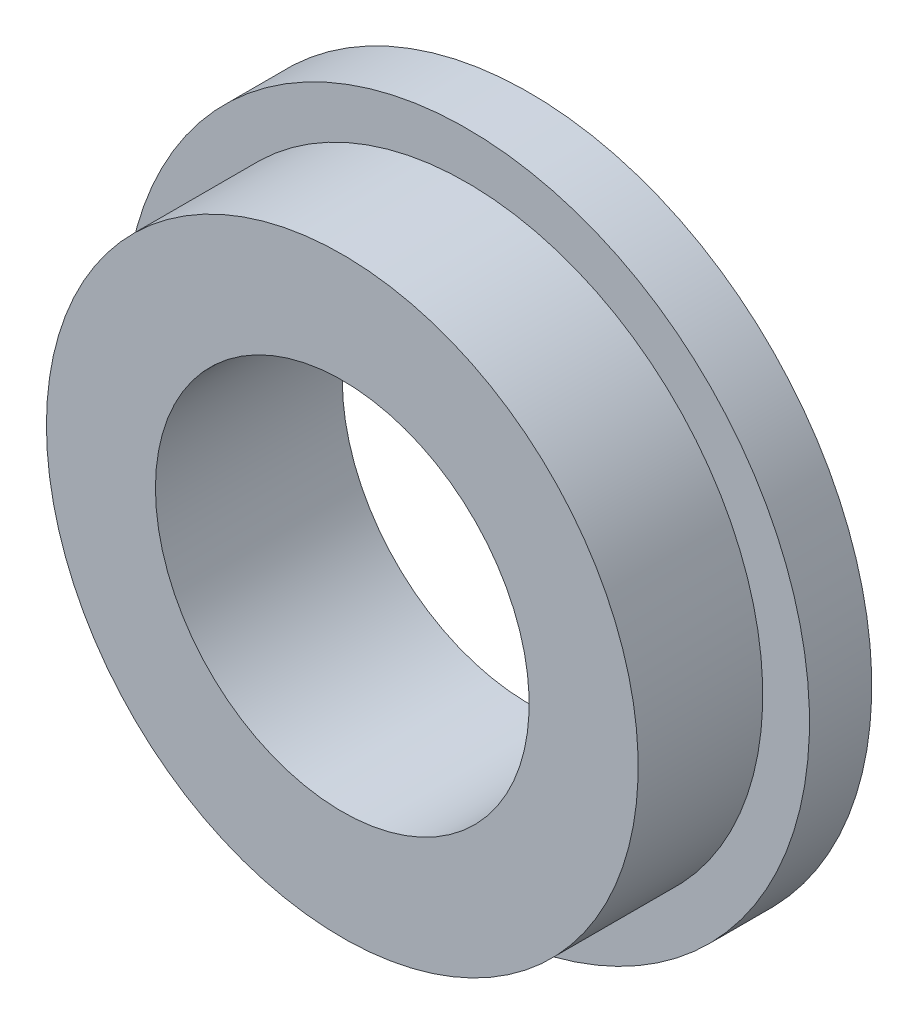
ISO-10303-21;
HEADER;
FILE_DESCRIPTION(('STEP AP214'),'2;1');
FILE_NAME('part.step','',(''),(''),'','','');
FILE_SCHEMA(('AUTOMOTIVE_DESIGN { 1 0 10303 214 1 1 1 1 }'));
ENDSEC;
DATA;
#1=APPLICATION_CONTEXT('core data for automotive mechanical design processes');
#2=APPLICATION_PROTOCOL_DEFINITION('international standard','automotive_design',2000,#1);
#3=PRODUCT_CONTEXT('',#1,'mechanical');
#4=PRODUCT('Part','Part','',(#3));
#5=PRODUCT_RELATED_PRODUCT_CATEGORY('part','',(#4));
#6=PRODUCT_DEFINITION_FORMATION('','',#4);
#7=PRODUCT_DEFINITION_CONTEXT('part definition',#1,'design');
#8=PRODUCT_DEFINITION('design','',#6,#7);
#9=PRODUCT_DEFINITION_SHAPE('','',#8);
#10=(LENGTH_UNIT() NAMED_UNIT(*) SI_UNIT(.MILLI.,.METRE.));
#11=(NAMED_UNIT(*) PLANE_ANGLE_UNIT() SI_UNIT($,.RADIAN.));
#12=(NAMED_UNIT(*) SI_UNIT($,.STERADIAN.) SOLID_ANGLE_UNIT());
#13=UNCERTAINTY_MEASURE_WITH_UNIT(LENGTH_MEASURE(1.E-05),#10,'distance_accuracy_value','');
#14=(GEOMETRIC_REPRESENTATION_CONTEXT(3) GLOBAL_UNCERTAINTY_ASSIGNED_CONTEXT((#13)) GLOBAL_UNIT_ASSIGNED_CONTEXT((#10,
#11,#12)) REPRESENTATION_CONTEXT('',''));
#15=CARTESIAN_POINT('',(0.,0.,0.));
#16=DIRECTION('',(0.,0.,1.));
#17=DIRECTION('',(1.,0.,0.));
#18=AXIS2_PLACEMENT_3D('',#15,#16,#17);
#19=CARTESIAN_POINT('',(0.,0.,1.));
#20=DIRECTION('',(0.,0.,1.));
#21=DIRECTION('',(-1.,0.,0.));
#22=AXIS2_PLACEMENT_3D('',#19,#20,#21);
#23=CYLINDRICAL_SURFACE('',#22,4.75);
#24=CARTESIAN_POINT('',(0.,0.,3.));
#25=DIRECTION('',(0.,0.,-1.));
#26=DIRECTION('',(-1.,0.,0.));
#27=AXIS2_PLACEMENT_3D('',#24,#25,#26);
#28=CIRCLE('',#27,4.75);
#29=CARTESIAN_POINT('',(-4.75,0.,3.));
#30=VERTEX_POINT('',#29);
#31=EDGE_CURVE('E10',#30,#30,#28,.T.);
#32=ORIENTED_EDGE('',*,*,#31,.T.);
#33=EDGE_LOOP('',(#32));
#34=FACE_BOUND('',#33,.T.);
#35=CARTESIAN_POINT('',(0.,0.,1.));
#36=DIRECTION('',(0.,0.,-1.));
#37=DIRECTION('',(-1.,0.,0.));
#38=AXIS2_PLACEMENT_3D('',#35,#36,#37);
#39=CIRCLE('',#38,4.75);
#40=CARTESIAN_POINT('',(-4.75,0.,1.));
#41=VERTEX_POINT('',#40);
#42=EDGE_CURVE('E31',#41,#41,#39,.T.);
#43=ORIENTED_EDGE('',*,*,#42,.F.);
#44=EDGE_LOOP('',(#43));
#45=FACE_BOUND('',#44,.T.);
#46=ADVANCED_FACE('F15',(#34,#45),#23,.T.);
#47=CARTESIAN_POINT('',(0.,0.,3.));
#48=DIRECTION('',(0.,0.,-1.));
#49=DIRECTION('',(-1.,0.,0.));
#50=AXIS2_PLACEMENT_3D('',#47,#48,#49);
#51=PLANE('',#50);
#52=ORIENTED_EDGE('',*,*,#31,.F.);
#53=EDGE_LOOP('',(#52));
#54=FACE_BOUND('',#53,.T.);
#55=CARTESIAN_POINT('',(0.,0.,3.));
#56=DIRECTION('',(0.,0.,-1.));
#57=DIRECTION('',(-1.,0.,0.));
#58=AXIS2_PLACEMENT_3D('',#55,#56,#57);
#59=CIRCLE('',#58,3.);
#60=CARTESIAN_POINT('',(-3.,0.,3.));
#61=VERTEX_POINT('',#60);
#62=EDGE_CURVE('E23',#61,#61,#59,.T.);
#63=ORIENTED_EDGE('',*,*,#62,.T.);
#64=EDGE_LOOP('',(#63));
#65=FACE_BOUND('',#64,.T.);
#66=ADVANCED_FACE('F48',(#54,#65),#51,.F.);
#67=CARTESIAN_POINT('',(0.,0.,0.));
#68=DIRECTION('',(0.,0.,1.));
#69=DIRECTION('',(-1.,0.,0.));
#70=AXIS2_PLACEMENT_3D('',#67,#68,#69);
#71=CYLINDRICAL_SURFACE('',#70,3.);
#72=ORIENTED_EDGE('',*,*,#62,.F.);
#73=EDGE_LOOP('',(#72));
#74=FACE_BOUND('',#73,.T.);
#75=CARTESIAN_POINT('',(0.,0.,0.));
#76=DIRECTION('',(0.,0.,1.));
#77=DIRECTION('',(-1.,0.,0.));
#78=AXIS2_PLACEMENT_3D('',#75,#76,#77);
#79=CIRCLE('',#78,3.);
#80=CARTESIAN_POINT('',(-3.,0.,0.));
#81=VERTEX_POINT('',#80);
#82=EDGE_CURVE('E34',#81,#81,#79,.T.);
#83=ORIENTED_EDGE('',*,*,#82,.F.);
#84=EDGE_LOOP('',(#83));
#85=FACE_BOUND('',#84,.T.);
#86=ADVANCED_FACE('F54',(#74,#85),#71,.F.);
#87=CARTESIAN_POINT('',(0.,0.,0.));
#88=DIRECTION('',(0.,0.,1.));
#89=DIRECTION('',(-1.,0.,0.));
#90=AXIS2_PLACEMENT_3D('',#87,#88,#89);
#91=CYLINDRICAL_SURFACE('',#90,5.5);
#92=CARTESIAN_POINT('',(0.,0.,1.));
#93=DIRECTION('',(0.,0.,-1.));
#94=DIRECTION('',(-1.,0.,0.));
#95=AXIS2_PLACEMENT_3D('',#92,#93,#94);
#96=CIRCLE('',#95,5.5);
#97=CARTESIAN_POINT('',(-5.5,0.,1.));
#98=VERTEX_POINT('',#97);
#99=EDGE_CURVE('E28',#98,#98,#96,.T.);
#100=ORIENTED_EDGE('',*,*,#99,.T.);
#101=EDGE_LOOP('',(#100));
#102=FACE_BOUND('',#101,.T.);
#103=CARTESIAN_POINT('',(0.,0.,0.));
#104=DIRECTION('',(0.,0.,-1.));
#105=DIRECTION('',(-1.,0.,0.));
#106=AXIS2_PLACEMENT_3D('',#103,#104,#105);
#107=CIRCLE('',#106,5.5);
#108=CARTESIAN_POINT('',(-5.5,0.,0.));
#109=VERTEX_POINT('',#108);
#110=EDGE_CURVE('E19',#109,#109,#107,.T.);
#111=ORIENTED_EDGE('',*,*,#110,.F.);
#112=EDGE_LOOP('',(#111));
#113=FACE_BOUND('',#112,.T.);
#114=ADVANCED_FACE('F39',(#102,#113),#91,.T.);
#115=CARTESIAN_POINT('',(0.,0.,1.));
#116=DIRECTION('',(0.,0.,-1.));
#117=DIRECTION('',(-1.,0.,0.));
#118=AXIS2_PLACEMENT_3D('',#115,#116,#117);
#119=PLANE('',#118);
#120=ORIENTED_EDGE('',*,*,#99,.F.);
#121=EDGE_LOOP('',(#120));
#122=FACE_BOUND('',#121,.T.);
#123=ORIENTED_EDGE('',*,*,#42,.T.);
#124=EDGE_LOOP('',(#123));
#125=FACE_BOUND('',#124,.T.);
#126=ADVANCED_FACE('F42',(#122,#125),#119,.F.);
#127=CARTESIAN_POINT('',(0.,0.,0.));
#128=DIRECTION('',(0.,0.,-1.));
#129=DIRECTION('',(-1.,0.,0.));
#130=AXIS2_PLACEMENT_3D('',#127,#128,#129);
#131=PLANE('',#130);
#132=ORIENTED_EDGE('',*,*,#110,.T.);
#133=EDGE_LOOP('',(#132));
#134=FACE_BOUND('',#133,.T.);
#135=ORIENTED_EDGE('',*,*,#82,.T.);
#136=EDGE_LOOP('',(#135));
#137=FACE_BOUND('',#136,.T.);
#138=ADVANCED_FACE('F17',(#134,#137),#131,.T.);
#139=CLOSED_SHELL('',(#46,#66,#86,#114,#126,#138));
#140=MANIFOLD_SOLID_BREP('B1',#139);
#141=ADVANCED_BREP_SHAPE_REPRESENTATION('',(#18,#140),#14);
#142=SHAPE_DEFINITION_REPRESENTATION(#9,#141);
ENDSEC;
END-ISO-10303-21;
